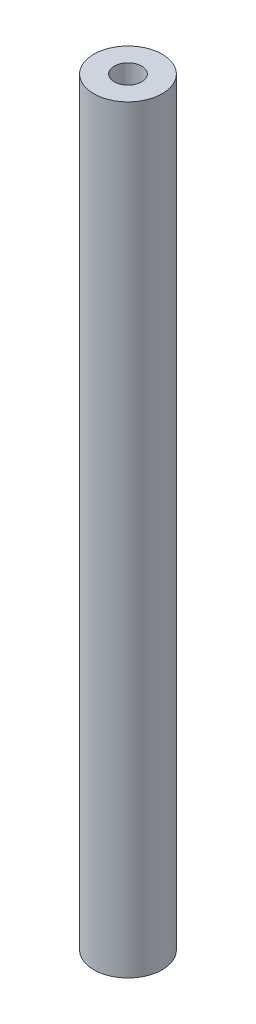
ISO-10303-21;
HEADER;
FILE_DESCRIPTION(('STEP AP214'),'2;1');
FILE_NAME('part.step','',(''),(''),'','','');
FILE_SCHEMA(('AUTOMOTIVE_DESIGN { 1 0 10303 214 1 1 1 1 }'));
ENDSEC;
DATA;
#1=APPLICATION_CONTEXT('core data for automotive mechanical design processes');
#2=APPLICATION_PROTOCOL_DEFINITION('international standard','automotive_design',2000,#1);
#3=PRODUCT_CONTEXT('',#1,'mechanical');
#4=PRODUCT('Part','Part','',(#3));
#5=PRODUCT_RELATED_PRODUCT_CATEGORY('part','',(#4));
#6=PRODUCT_DEFINITION_FORMATION('','',#4);
#7=PRODUCT_DEFINITION_CONTEXT('part definition',#1,'design');
#8=PRODUCT_DEFINITION('design','',#6,#7);
#9=PRODUCT_DEFINITION_SHAPE('','',#8);
#10=(LENGTH_UNIT() NAMED_UNIT(*) SI_UNIT(.MILLI.,.METRE.));
#11=(NAMED_UNIT(*) PLANE_ANGLE_UNIT() SI_UNIT($,.RADIAN.));
#12=(NAMED_UNIT(*) SI_UNIT($,.STERADIAN.) SOLID_ANGLE_UNIT());
#13=UNCERTAINTY_MEASURE_WITH_UNIT(LENGTH_MEASURE(1.E-05),#10,'distance_accuracy_value','');
#14=(GEOMETRIC_REPRESENTATION_CONTEXT(3) GLOBAL_UNCERTAINTY_ASSIGNED_CONTEXT((#13)) GLOBAL_UNIT_ASSIGNED_CONTEXT((#10,
#11,#12)) REPRESENTATION_CONTEXT('',''));
#15=CARTESIAN_POINT('',(0.,0.,0.));
#16=DIRECTION('',(0.,0.,1.));
#17=DIRECTION('',(1.,0.,0.));
#18=AXIS2_PLACEMENT_3D('',#15,#16,#17);
#19=CARTESIAN_POINT('',(0.,55.4,0.));
#20=DIRECTION('',(0.,1.,0.));
#21=DIRECTION('',(0.,0.,1.));
#22=AXIS2_PLACEMENT_3D('',#19,#20,#21);
#23=PLANE('',#22);
#24=CARTESIAN_POINT('',(0.,55.4,0.));
#25=DIRECTION('',(0.,1.,0.));
#26=DIRECTION('',(0.,0.,1.));
#27=AXIS2_PLACEMENT_3D('',#24,#25,#26);
#28=CIRCLE('',#27,2.5);
#29=CARTESIAN_POINT('',(0.,55.4,2.5));
#30=VERTEX_POINT('',#29);
#31=EDGE_CURVE('E10',#30,#30,#28,.T.);
#32=ORIENTED_EDGE('',*,*,#31,.T.);
#33=EDGE_LOOP('',(#32));
#34=FACE_BOUND('',#33,.T.);
#35=CARTESIAN_POINT('',(0.,55.4,0.));
#36=DIRECTION('',(0.,1.,0.));
#37=DIRECTION('',(0.,0.,1.));
#38=AXIS2_PLACEMENT_3D('',#35,#36,#37);
#39=CIRCLE('',#38,1.);
#40=CARTESIAN_POINT('',(0.,55.4,1.));
#41=VERTEX_POINT('',#40);
#42=EDGE_CURVE('E54',#41,#41,#39,.T.);
#43=ORIENTED_EDGE('',*,*,#42,.F.);
#44=EDGE_LOOP('',(#43));
#45=FACE_BOUND('',#44,.T.);
#46=ADVANCED_FACE('F41',(#34,#45),#23,.T.);
#47=CARTESIAN_POINT('',(0.,0.,0.));
#48=DIRECTION('',(0.,1.,0.));
#49=DIRECTION('',(0.,0.,1.));
#50=AXIS2_PLACEMENT_3D('',#47,#48,#49);
#51=PLANE('',#50);
#52=CARTESIAN_POINT('',(0.,0.,0.));
#53=DIRECTION('',(0.,1.,0.));
#54=DIRECTION('',(0.,0.,1.));
#55=AXIS2_PLACEMENT_3D('',#52,#53,#54);
#56=CIRCLE('',#55,2.5);
#57=CARTESIAN_POINT('',(0.,0.,2.5));
#58=VERTEX_POINT('',#57);
#59=EDGE_CURVE('E45',#58,#58,#56,.T.);
#60=ORIENTED_EDGE('',*,*,#59,.F.);
#61=EDGE_LOOP('',(#60));
#62=FACE_BOUND('',#61,.T.);
#63=CARTESIAN_POINT('',(0.,0.,0.));
#64=DIRECTION('',(0.,1.,0.));
#65=DIRECTION('',(0.,0.,1.));
#66=AXIS2_PLACEMENT_3D('',#63,#64,#65);
#67=CIRCLE('',#66,1.);
#68=CARTESIAN_POINT('',(0.,0.,1.));
#69=VERTEX_POINT('',#68);
#70=EDGE_CURVE('E56',#69,#69,#67,.T.);
#71=ORIENTED_EDGE('',*,*,#70,.T.);
#72=EDGE_LOOP('',(#71));
#73=FACE_BOUND('',#72,.T.);
#74=ADVANCED_FACE('F68',(#62,#73),#51,.F.);
#75=CARTESIAN_POINT('',(0.,55.4,0.));
#76=DIRECTION('',(0.,-1.,0.));
#77=DIRECTION('',(0.,0.,-1.));
#78=AXIS2_PLACEMENT_3D('',#75,#76,#77);
#79=CYLINDRICAL_SURFACE('',#78,2.5);
#80=ORIENTED_EDGE('',*,*,#31,.F.);
#81=EDGE_LOOP('',(#80));
#82=FACE_BOUND('',#81,.T.);
#83=ORIENTED_EDGE('',*,*,#59,.T.);
#84=EDGE_LOOP('',(#83));
#85=FACE_BOUND('',#84,.T.);
#86=ADVANCED_FACE('F43',(#82,#85),#79,.T.);
#87=CARTESIAN_POINT('',(0.,55.4,0.));
#88=DIRECTION('',(0.,-1.,0.));
#89=DIRECTION('',(0.,0.,-1.));
#90=AXIS2_PLACEMENT_3D('',#87,#88,#89);
#91=CYLINDRICAL_SURFACE('',#90,1.);
#92=ORIENTED_EDGE('',*,*,#42,.T.);
#93=EDGE_LOOP('',(#92));
#94=FACE_BOUND('',#93,.T.);
#95=ORIENTED_EDGE('',*,*,#70,.F.);
#96=EDGE_LOOP('',(#95));
#97=FACE_BOUND('',#96,.T.);
#98=ADVANCED_FACE('F64',(#94,#97),#91,.F.);
#99=CLOSED_SHELL('',(#46,#74,#86,#98));
#100=MANIFOLD_SOLID_BREP('B2',#99);
#101=ADVANCED_BREP_SHAPE_REPRESENTATION('',(#18,#100),#14);
#102=SHAPE_DEFINITION_REPRESENTATION(#9,#101);
ENDSEC;
END-ISO-10303-21;
